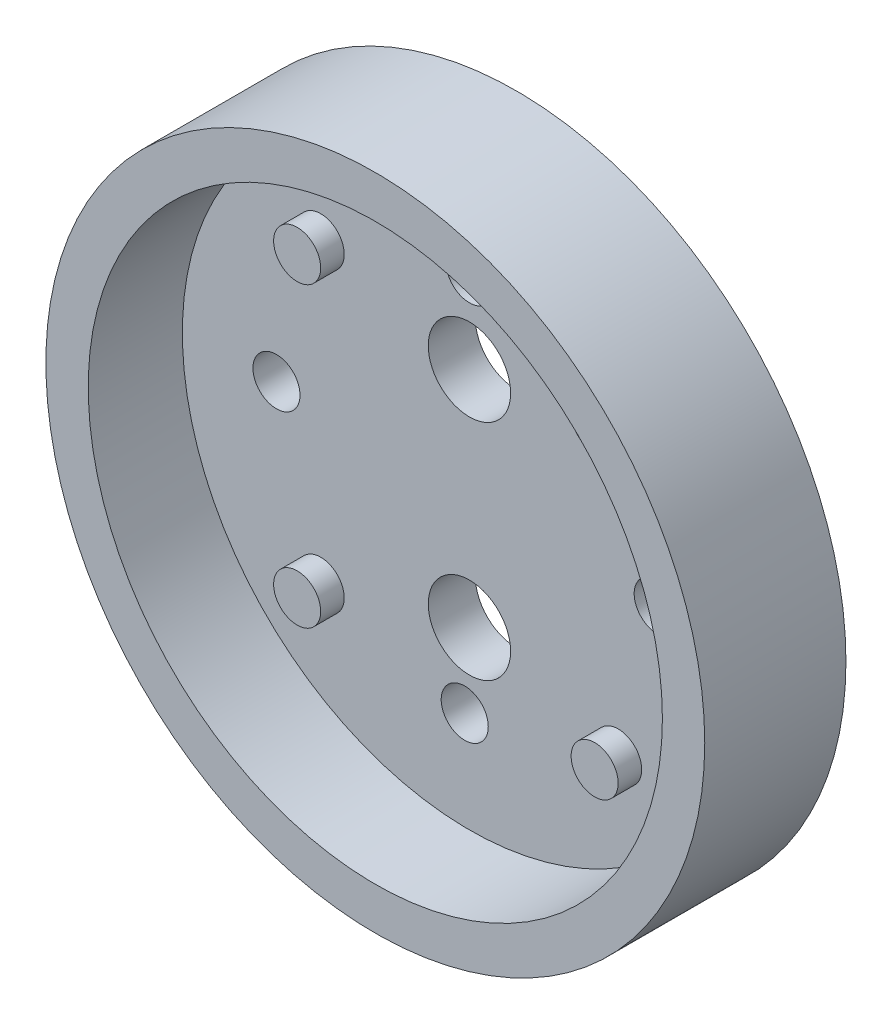
ISO-10303-21;
HEADER;
FILE_DESCRIPTION(('STEP AP214'),'2;1');
FILE_NAME('part.step','',(''),(''),'','','');
FILE_SCHEMA(('AUTOMOTIVE_DESIGN { 1 0 10303 214 1 1 1 1 }'));
ENDSEC;
DATA;
#1=APPLICATION_CONTEXT('core data for automotive mechanical design processes');
#2=APPLICATION_PROTOCOL_DEFINITION('international standard','automotive_design',2000,#1);
#3=PRODUCT_CONTEXT('',#1,'mechanical');
#4=PRODUCT('Part','Part','',(#3));
#5=PRODUCT_RELATED_PRODUCT_CATEGORY('part','',(#4));
#6=PRODUCT_DEFINITION_FORMATION('','',#4);
#7=PRODUCT_DEFINITION_CONTEXT('part definition',#1,'design');
#8=PRODUCT_DEFINITION('design','',#6,#7);
#9=PRODUCT_DEFINITION_SHAPE('','',#8);
#10=(LENGTH_UNIT() NAMED_UNIT(*) SI_UNIT(.MILLI.,.METRE.));
#11=(NAMED_UNIT(*) PLANE_ANGLE_UNIT() SI_UNIT($,.RADIAN.));
#12=(NAMED_UNIT(*) SI_UNIT($,.STERADIAN.) SOLID_ANGLE_UNIT());
#13=UNCERTAINTY_MEASURE_WITH_UNIT(LENGTH_MEASURE(1.E-05),#10,'distance_accuracy_value','');
#14=(GEOMETRIC_REPRESENTATION_CONTEXT(3) GLOBAL_UNCERTAINTY_ASSIGNED_CONTEXT((#13)) GLOBAL_UNIT_ASSIGNED_CONTEXT((#10,
#11,#12)) REPRESENTATION_CONTEXT('',''));
#15=CARTESIAN_POINT('',(0.,0.,0.));
#16=DIRECTION('',(0.,0.,1.));
#17=DIRECTION('',(1.,0.,0.));
#18=AXIS2_PLACEMENT_3D('',#15,#16,#17);
#19=CARTESIAN_POINT('',(0.,0.,2.));
#20=DIRECTION('',(0.,0.,1.));
#21=DIRECTION('',(1.,0.,0.));
#22=AXIS2_PLACEMENT_3D('',#19,#20,#21);
#23=PLANE('',#22);
#24=CARTESIAN_POINT('',(6.32077084341238,6.32077084341231,2.));
#25=DIRECTION('',(0.,0.,1.));
#26=DIRECTION('',(1.,0.,0.));
#27=AXIS2_PLACEMENT_3D('',#24,#25,#26);
#28=CIRCLE('',#27,0.999999999999999);
#29=CARTESIAN_POINT('',(7.32077084341238,6.32077084341231,2.));
#30=VERTEX_POINT('',#29);
#31=EDGE_CURVE('E102',#30,#30,#28,.T.);
#32=ORIENTED_EDGE('',*,*,#31,.F.);
#33=EDGE_LOOP('',(#32));
#34=FACE_BOUND('',#33,.T.);
#35=CARTESIAN_POINT('',(-6.32077084341233,-6.32077084341236,2.));
#36=DIRECTION('',(0.,0.,1.));
#37=DIRECTION('',(1.,0.,0.));
#38=AXIS2_PLACEMENT_3D('',#35,#36,#37);
#39=CIRCLE('',#38,1.);
#40=CARTESIAN_POINT('',(-5.32077084341233,-6.32077084341236,2.));
#41=VERTEX_POINT('',#40);
#42=EDGE_CURVE('E90',#41,#41,#39,.T.);
#43=ORIENTED_EDGE('',*,*,#42,.F.);
#44=EDGE_LOOP('',(#43));
#45=FACE_BOUND('',#44,.T.);
#46=CARTESIAN_POINT('',(0.,-4.75,2.));
#47=DIRECTION('',(0.,0.,1.));
#48=DIRECTION('',(1.,0.,0.));
#49=AXIS2_PLACEMENT_3D('',#46,#47,#48);
#50=CIRCLE('',#49,1.75);
#51=CARTESIAN_POINT('',(1.75,-4.75,2.));
#52=VERTEX_POINT('',#51);
#53=EDGE_CURVE('E84',#52,#52,#50,.T.);
#54=ORIENTED_EDGE('',*,*,#53,.F.);
#55=EDGE_LOOP('',(#54));
#56=FACE_BOUND('',#55,.T.);
#57=CARTESIAN_POINT('',(0.,4.75,2.));
#58=DIRECTION('',(0.,0.,1.));
#59=DIRECTION('',(1.,0.,0.));
#60=AXIS2_PLACEMENT_3D('',#57,#58,#59);
#61=CIRCLE('',#60,1.75);
#62=CARTESIAN_POINT('',(1.75,4.75,2.));
#63=VERTEX_POINT('',#62);
#64=EDGE_CURVE('E78',#63,#63,#61,.T.);
#65=ORIENTED_EDGE('',*,*,#64,.F.);
#66=EDGE_LOOP('',(#65));
#67=FACE_BOUND('',#66,.T.);
#68=CARTESIAN_POINT('',(-8.2,0.2,2.));
#69=DIRECTION('',(0.,0.,1.));
#70=DIRECTION('',(1.,0.,0.));
#71=AXIS2_PLACEMENT_3D('',#68,#69,#70);
#72=CIRCLE('',#71,1.);
#73=CARTESIAN_POINT('',(-7.2,0.2,2.));
#74=VERTEX_POINT('',#73);
#75=EDGE_CURVE('E72',#74,#74,#72,.T.);
#76=ORIENTED_EDGE('',*,*,#75,.F.);
#77=EDGE_LOOP('',(#76));
#78=FACE_BOUND('',#77,.T.);
#79=CARTESIAN_POINT('',(-0.200000000000001,-8.,2.));
#80=DIRECTION('',(0.,0.,1.));
#81=DIRECTION('',(1.,0.,0.));
#82=AXIS2_PLACEMENT_3D('',#79,#80,#81);
#83=CIRCLE('',#82,1.);
#84=CARTESIAN_POINT('',(0.799999999999999,-8.,2.));
#85=VERTEX_POINT('',#84);
#86=EDGE_CURVE('E66',#85,#85,#83,.T.);
#87=ORIENTED_EDGE('',*,*,#86,.F.);
#88=EDGE_LOOP('',(#87));
#89=FACE_BOUND('',#88,.T.);
#90=CARTESIAN_POINT('',(8.,0.,2.));
#91=DIRECTION('',(0.,0.,1.));
#92=DIRECTION('',(1.,0.,0.));
#93=AXIS2_PLACEMENT_3D('',#90,#91,#92);
#94=CIRCLE('',#93,1.);
#95=CARTESIAN_POINT('',(9.,0.,2.));
#96=VERTEX_POINT('',#95);
#97=EDGE_CURVE('E60',#96,#96,#94,.T.);
#98=ORIENTED_EDGE('',*,*,#97,.F.);
#99=EDGE_LOOP('',(#98));
#100=FACE_BOUND('',#99,.T.);
#101=CARTESIAN_POINT('',(0.,8.2,2.));
#102=DIRECTION('',(0.,0.,1.));
#103=DIRECTION('',(1.,0.,0.));
#104=AXIS2_PLACEMENT_3D('',#101,#102,#103);
#105=CIRCLE('',#104,1.);
#106=CARTESIAN_POINT('',(1.,8.2,2.));
#107=VERTEX_POINT('',#106);
#108=EDGE_CURVE('E54',#107,#107,#105,.T.);
#109=ORIENTED_EDGE('',*,*,#108,.F.);
#110=EDGE_LOOP('',(#109));
#111=FACE_BOUND('',#110,.T.);
#112=CARTESIAN_POINT('',(0.,0.,2.));
#113=DIRECTION('',(0.,0.,1.));
#114=DIRECTION('',(1.,0.,0.));
#115=AXIS2_PLACEMENT_3D('',#112,#113,#114);
#116=CIRCLE('',#115,12.2);
#117=CARTESIAN_POINT('',(12.2,0.,2.));
#118=VERTEX_POINT('',#117);
#119=EDGE_CURVE('E10',#118,#118,#116,.F.);
#120=ORIENTED_EDGE('',*,*,#119,.F.);
#121=EDGE_LOOP('',(#120));
#122=FACE_BOUND('',#121,.T.);
#123=CARTESIAN_POINT('',(-6.32077084341234,6.32077084341236,2.));
#124=DIRECTION('',(0.,0.,1.));
#125=DIRECTION('',(1.,0.,0.));
#126=AXIS2_PLACEMENT_3D('',#123,#124,#125);
#127=CIRCLE('',#126,1.);
#128=CARTESIAN_POINT('',(-5.32077084341234,6.32077084341236,2.));
#129=VERTEX_POINT('',#128);
#130=EDGE_CURVE('E96',#129,#129,#127,.T.);
#131=ORIENTED_EDGE('',*,*,#130,.F.);
#132=EDGE_LOOP('',(#131));
#133=FACE_BOUND('',#132,.T.);
#134=CARTESIAN_POINT('',(6.3207708434123,-6.3207708434124,2.));
#135=DIRECTION('',(0.,0.,1.));
#136=DIRECTION('',(1.,0.,0.));
#137=AXIS2_PLACEMENT_3D('',#134,#135,#136);
#138=CIRCLE('',#137,0.999999999999999);
#139=CARTESIAN_POINT('',(7.32077084341229,-6.3207708434124,2.));
#140=VERTEX_POINT('',#139);
#141=EDGE_CURVE('E108',#140,#140,#138,.T.);
#142=ORIENTED_EDGE('',*,*,#141,.F.);
#143=EDGE_LOOP('',(#142));
#144=FACE_BOUND('',#143,.T.);
#145=ADVANCED_FACE('F33',(#34,#45,#56,#67,#78,#89,#100,#111,#122,#133,#144),#23,.T.);
#146=CARTESIAN_POINT('',(0.,0.,2.));
#147=DIRECTION('',(0.,0.,-1.));
#148=DIRECTION('',(-1.,0.,0.));
#149=AXIS2_PLACEMENT_3D('',#146,#147,#148);
#150=CYLINDRICAL_SURFACE('',#149,14.);
#151=CARTESIAN_POINT('',(0.,0.,0.));
#152=DIRECTION('',(0.,0.,1.));
#153=DIRECTION('',(1.,0.,0.));
#154=AXIS2_PLACEMENT_3D('',#151,#152,#153);
#155=CIRCLE('',#154,14.);
#156=CARTESIAN_POINT('',(14.,0.,0.));
#157=VERTEX_POINT('',#156);
#158=EDGE_CURVE('E40',#157,#157,#155,.T.);
#159=ORIENTED_EDGE('',*,*,#158,.T.);
#160=EDGE_LOOP('',(#159));
#161=FACE_BOUND('',#160,.T.);
#162=CARTESIAN_POINT('',(0.,0.,6.));
#163=DIRECTION('',(0.,0.,1.));
#164=DIRECTION('',(1.,0.,0.));
#165=AXIS2_PLACEMENT_3D('',#162,#163,#164);
#166=CIRCLE('',#165,14.);
#167=CARTESIAN_POINT('',(14.,0.,6.));
#168=VERTEX_POINT('',#167);
#169=EDGE_CURVE('E44',#168,#168,#166,.T.);
#170=ORIENTED_EDGE('',*,*,#169,.F.);
#171=EDGE_LOOP('',(#170));
#172=FACE_BOUND('',#171,.T.);
#173=ADVANCED_FACE('F35',(#161,#172),#150,.T.);
#174=CARTESIAN_POINT('',(0.,0.,0.));
#175=DIRECTION('',(0.,0.,1.));
#176=DIRECTION('',(1.,0.,0.));
#177=AXIS2_PLACEMENT_3D('',#174,#175,#176);
#178=PLANE('',#177);
#179=CARTESIAN_POINT('',(0.,-4.75,0.));
#180=DIRECTION('',(0.,0.,1.));
#181=DIRECTION('',(1.,0.,0.));
#182=AXIS2_PLACEMENT_3D('',#179,#180,#181);
#183=CIRCLE('',#182,1.75);
#184=CARTESIAN_POINT('',(1.75,-4.75,0.));
#185=VERTEX_POINT('',#184);
#186=EDGE_CURVE('E81',#185,#185,#183,.T.);
#187=ORIENTED_EDGE('',*,*,#186,.T.);
#188=EDGE_LOOP('',(#187));
#189=FACE_BOUND('',#188,.T.);
#190=CARTESIAN_POINT('',(0.,4.75,0.));
#191=DIRECTION('',(0.,0.,1.));
#192=DIRECTION('',(1.,0.,0.));
#193=AXIS2_PLACEMENT_3D('',#190,#191,#192);
#194=CIRCLE('',#193,1.75);
#195=CARTESIAN_POINT('',(1.75,4.75,0.));
#196=VERTEX_POINT('',#195);
#197=EDGE_CURVE('E75',#196,#196,#194,.T.);
#198=ORIENTED_EDGE('',*,*,#197,.T.);
#199=EDGE_LOOP('',(#198));
#200=FACE_BOUND('',#199,.T.);
#201=CARTESIAN_POINT('',(-8.2,0.2,0.));
#202=DIRECTION('',(0.,0.,1.));
#203=DIRECTION('',(1.,0.,0.));
#204=AXIS2_PLACEMENT_3D('',#201,#202,#203);
#205=CIRCLE('',#204,1.);
#206=CARTESIAN_POINT('',(-7.2,0.2,0.));
#207=VERTEX_POINT('',#206);
#208=EDGE_CURVE('E69',#207,#207,#205,.T.);
#209=ORIENTED_EDGE('',*,*,#208,.T.);
#210=EDGE_LOOP('',(#209));
#211=FACE_BOUND('',#210,.T.);
#212=CARTESIAN_POINT('',(-0.200000000000001,-8.,0.));
#213=DIRECTION('',(0.,0.,1.));
#214=DIRECTION('',(1.,0.,0.));
#215=AXIS2_PLACEMENT_3D('',#212,#213,#214);
#216=CIRCLE('',#215,1.);
#217=CARTESIAN_POINT('',(0.799999999999999,-8.,0.));
#218=VERTEX_POINT('',#217);
#219=EDGE_CURVE('E63',#218,#218,#216,.T.);
#220=ORIENTED_EDGE('',*,*,#219,.T.);
#221=EDGE_LOOP('',(#220));
#222=FACE_BOUND('',#221,.T.);
#223=CARTESIAN_POINT('',(8.,0.,0.));
#224=DIRECTION('',(0.,0.,1.));
#225=DIRECTION('',(1.,0.,0.));
#226=AXIS2_PLACEMENT_3D('',#223,#224,#225);
#227=CIRCLE('',#226,1.);
#228=CARTESIAN_POINT('',(9.,0.,0.));
#229=VERTEX_POINT('',#228);
#230=EDGE_CURVE('E57',#229,#229,#227,.T.);
#231=ORIENTED_EDGE('',*,*,#230,.T.);
#232=EDGE_LOOP('',(#231));
#233=FACE_BOUND('',#232,.T.);
#234=CARTESIAN_POINT('',(0.,8.2,0.));
#235=DIRECTION('',(0.,0.,1.));
#236=DIRECTION('',(1.,0.,0.));
#237=AXIS2_PLACEMENT_3D('',#234,#235,#236);
#238=CIRCLE('',#237,1.);
#239=CARTESIAN_POINT('',(1.,8.2,0.));
#240=VERTEX_POINT('',#239);
#241=EDGE_CURVE('E53',#240,#240,#238,.T.);
#242=ORIENTED_EDGE('',*,*,#241,.T.);
#243=EDGE_LOOP('',(#242));
#244=FACE_BOUND('',#243,.T.);
#245=ORIENTED_EDGE('',*,*,#158,.F.);
#246=EDGE_LOOP('',(#245));
#247=FACE_BOUND('',#246,.T.);
#248=ADVANCED_FACE('F129',(#189,#200,#211,#222,#233,#244,#247),#178,.F.);
#249=CARTESIAN_POINT('',(0.,0.,6.));
#250=DIRECTION('',(0.,0.,1.));
#251=DIRECTION('',(1.,0.,0.));
#252=AXIS2_PLACEMENT_3D('',#249,#250,#251);
#253=PLANE('',#252);
#254=ORIENTED_EDGE('',*,*,#169,.T.);
#255=EDGE_LOOP('',(#254));
#256=FACE_BOUND('',#255,.T.);
#257=CARTESIAN_POINT('',(0.,0.,6.));
#258=DIRECTION('',(0.,0.,1.));
#259=DIRECTION('',(1.,0.,0.));
#260=AXIS2_PLACEMENT_3D('',#257,#258,#259);
#261=CIRCLE('',#260,12.2);
#262=CARTESIAN_POINT('',(12.2,0.,6.));
#263=VERTEX_POINT('',#262);
#264=EDGE_CURVE('E48',#263,#263,#261,.T.);
#265=ORIENTED_EDGE('',*,*,#264,.F.);
#266=EDGE_LOOP('',(#265));
#267=FACE_BOUND('',#266,.T.);
#268=ADVANCED_FACE('F133',(#256,#267),#253,.T.);
#269=CARTESIAN_POINT('',(0.,0.,6.));
#270=DIRECTION('',(0.,0.,-1.));
#271=DIRECTION('',(-1.,0.,0.));
#272=AXIS2_PLACEMENT_3D('',#269,#270,#271);
#273=CYLINDRICAL_SURFACE('',#272,12.2);
#274=ORIENTED_EDGE('',*,*,#264,.T.);
#275=EDGE_LOOP('',(#274));
#276=FACE_BOUND('',#275,.T.);
#277=ORIENTED_EDGE('',*,*,#119,.T.);
#278=EDGE_LOOP('',(#277));
#279=FACE_BOUND('',#278,.T.);
#280=ADVANCED_FACE('F140',(#276,#279),#273,.F.);
#281=CARTESIAN_POINT('',(0.,8.2,0.));
#282=DIRECTION('',(0.,0.,1.));
#283=DIRECTION('',(1.,0.,0.));
#284=AXIS2_PLACEMENT_3D('',#281,#282,#283);
#285=CYLINDRICAL_SURFACE('',#284,1.);
#286=ORIENTED_EDGE('',*,*,#241,.F.);
#287=EDGE_LOOP('',(#286));
#288=FACE_BOUND('',#287,.T.);
#289=ORIENTED_EDGE('',*,*,#108,.T.);
#290=EDGE_LOOP('',(#289));
#291=FACE_BOUND('',#290,.T.);
#292=ADVANCED_FACE('F155',(#288,#291),#285,.F.);
#293=CARTESIAN_POINT('',(8.,0.,0.));
#294=DIRECTION('',(0.,0.,1.));
#295=DIRECTION('',(1.,0.,0.));
#296=AXIS2_PLACEMENT_3D('',#293,#294,#295);
#297=CYLINDRICAL_SURFACE('',#296,1.);
#298=ORIENTED_EDGE('',*,*,#230,.F.);
#299=EDGE_LOOP('',(#298));
#300=FACE_BOUND('',#299,.T.);
#301=ORIENTED_EDGE('',*,*,#97,.T.);
#302=EDGE_LOOP('',(#301));
#303=FACE_BOUND('',#302,.T.);
#304=ADVANCED_FACE('F158',(#300,#303),#297,.F.);
#305=CARTESIAN_POINT('',(-0.200000000000001,-8.,0.));
#306=DIRECTION('',(0.,0.,1.));
#307=DIRECTION('',(1.,0.,0.));
#308=AXIS2_PLACEMENT_3D('',#305,#306,#307);
#309=CYLINDRICAL_SURFACE('',#308,1.);
#310=ORIENTED_EDGE('',*,*,#219,.F.);
#311=EDGE_LOOP('',(#310));
#312=FACE_BOUND('',#311,.T.);
#313=ORIENTED_EDGE('',*,*,#86,.T.);
#314=EDGE_LOOP('',(#313));
#315=FACE_BOUND('',#314,.T.);
#316=ADVANCED_FACE('F199',(#312,#315),#309,.F.);
#317=CARTESIAN_POINT('',(-8.2,0.2,0.));
#318=DIRECTION('',(0.,0.,1.));
#319=DIRECTION('',(1.,0.,0.));
#320=AXIS2_PLACEMENT_3D('',#317,#318,#319);
#321=CYLINDRICAL_SURFACE('',#320,1.);
#322=ORIENTED_EDGE('',*,*,#208,.F.);
#323=EDGE_LOOP('',(#322));
#324=FACE_BOUND('',#323,.T.);
#325=ORIENTED_EDGE('',*,*,#75,.T.);
#326=EDGE_LOOP('',(#325));
#327=FACE_BOUND('',#326,.T.);
#328=ADVANCED_FACE('F195',(#324,#327),#321,.F.);
#329=CARTESIAN_POINT('',(0.,4.75,0.));
#330=DIRECTION('',(0.,0.,1.));
#331=DIRECTION('',(1.,0.,0.));
#332=AXIS2_PLACEMENT_3D('',#329,#330,#331);
#333=CYLINDRICAL_SURFACE('',#332,1.75);
#334=ORIENTED_EDGE('',*,*,#197,.F.);
#335=EDGE_LOOP('',(#334));
#336=FACE_BOUND('',#335,.T.);
#337=ORIENTED_EDGE('',*,*,#64,.T.);
#338=EDGE_LOOP('',(#337));
#339=FACE_BOUND('',#338,.T.);
#340=ADVANCED_FACE('F191',(#336,#339),#333,.F.);
#341=CARTESIAN_POINT('',(0.,-4.75,0.));
#342=DIRECTION('',(0.,0.,1.));
#343=DIRECTION('',(1.,0.,0.));
#344=AXIS2_PLACEMENT_3D('',#341,#342,#343);
#345=CYLINDRICAL_SURFACE('',#344,1.75);
#346=ORIENTED_EDGE('',*,*,#186,.F.);
#347=EDGE_LOOP('',(#346));
#348=FACE_BOUND('',#347,.T.);
#349=ORIENTED_EDGE('',*,*,#53,.T.);
#350=EDGE_LOOP('',(#349));
#351=FACE_BOUND('',#350,.T.);
#352=ADVANCED_FACE('F187',(#348,#351),#345,.F.);
#353=CARTESIAN_POINT('',(-6.32077084341233,-6.32077084341236,3.));
#354=DIRECTION('',(0.,0.,-1.));
#355=DIRECTION('',(-1.,0.,0.));
#356=AXIS2_PLACEMENT_3D('',#353,#354,#355);
#357=CYLINDRICAL_SURFACE('',#356,1.);
#358=CARTESIAN_POINT('',(-6.32077084341233,-6.32077084341236,3.));
#359=DIRECTION('',(0.,0.,1.));
#360=DIRECTION('',(1.,0.,0.));
#361=AXIS2_PLACEMENT_3D('',#358,#359,#360);
#362=CIRCLE('',#361,1.);
#363=CARTESIAN_POINT('',(-5.32077084341233,-6.32077084341236,3.));
#364=VERTEX_POINT('',#363);
#365=EDGE_CURVE('E87',#364,#364,#362,.T.);
#366=ORIENTED_EDGE('',*,*,#365,.F.);
#367=EDGE_LOOP('',(#366));
#368=FACE_BOUND('',#367,.T.);
#369=ORIENTED_EDGE('',*,*,#42,.T.);
#370=EDGE_LOOP('',(#369));
#371=FACE_BOUND('',#370,.T.);
#372=ADVANCED_FACE('F179',(#368,#371),#357,.T.);
#373=CARTESIAN_POINT('',(-6.32077084341233,-6.32077084341236,3.));
#374=DIRECTION('',(0.,0.,1.));
#375=DIRECTION('',(1.,0.,0.));
#376=AXIS2_PLACEMENT_3D('',#373,#374,#375);
#377=PLANE('',#376);
#378=ORIENTED_EDGE('',*,*,#365,.T.);
#379=EDGE_LOOP('',(#378));
#380=FACE_BOUND('',#379,.T.);
#381=ADVANCED_FACE('F169',(#380),#377,.T.);
#382=CARTESIAN_POINT('',(-6.32077084341234,6.32077084341236,3.));
#383=DIRECTION('',(0.,0.,-1.));
#384=DIRECTION('',(-1.,0.,0.));
#385=AXIS2_PLACEMENT_3D('',#382,#383,#384);
#386=CYLINDRICAL_SURFACE('',#385,1.);
#387=CARTESIAN_POINT('',(-6.32077084341234,6.32077084341236,3.));
#388=DIRECTION('',(0.,0.,1.));
#389=DIRECTION('',(1.,0.,0.));
#390=AXIS2_PLACEMENT_3D('',#387,#388,#389);
#391=CIRCLE('',#390,1.);
#392=CARTESIAN_POINT('',(-5.32077084341234,6.32077084341236,3.));
#393=VERTEX_POINT('',#392);
#394=EDGE_CURVE('E93',#393,#393,#391,.T.);
#395=ORIENTED_EDGE('',*,*,#394,.F.);
#396=EDGE_LOOP('',(#395));
#397=FACE_BOUND('',#396,.T.);
#398=ORIENTED_EDGE('',*,*,#130,.T.);
#399=EDGE_LOOP('',(#398));
#400=FACE_BOUND('',#399,.T.);
#401=ADVANCED_FACE('F166',(#397,#400),#386,.T.);
#402=CARTESIAN_POINT('',(-6.32077084341234,6.32077084341236,3.));
#403=DIRECTION('',(0.,0.,1.));
#404=DIRECTION('',(1.,0.,0.));
#405=AXIS2_PLACEMENT_3D('',#402,#403,#404);
#406=PLANE('',#405);
#407=ORIENTED_EDGE('',*,*,#394,.T.);
#408=EDGE_LOOP('',(#407));
#409=FACE_BOUND('',#408,.T.);
#410=ADVANCED_FACE('F168',(#409),#406,.T.);
#411=CARTESIAN_POINT('',(6.32077084341238,6.32077084341231,3.));
#412=DIRECTION('',(0.,0.,-1.));
#413=DIRECTION('',(-1.,0.,0.));
#414=AXIS2_PLACEMENT_3D('',#411,#412,#413);
#415=CYLINDRICAL_SURFACE('',#414,0.999999999999999);
#416=CARTESIAN_POINT('',(6.32077084341238,6.32077084341231,3.));
#417=DIRECTION('',(0.,0.,1.));
#418=DIRECTION('',(1.,0.,0.));
#419=AXIS2_PLACEMENT_3D('',#416,#417,#418);
#420=CIRCLE('',#419,0.999999999999999);
#421=CARTESIAN_POINT('',(7.32077084341238,6.32077084341231,3.));
#422=VERTEX_POINT('',#421);
#423=EDGE_CURVE('E99',#422,#422,#420,.T.);
#424=ORIENTED_EDGE('',*,*,#423,.F.);
#425=EDGE_LOOP('',(#424));
#426=FACE_BOUND('',#425,.T.);
#427=ORIENTED_EDGE('',*,*,#31,.T.);
#428=EDGE_LOOP('',(#427));
#429=FACE_BOUND('',#428,.T.);
#430=ADVANCED_FACE('F176',(#426,#429),#415,.T.);
#431=CARTESIAN_POINT('',(6.32077084341238,6.32077084341231,3.));
#432=DIRECTION('',(0.,0.,1.));
#433=DIRECTION('',(1.,0.,0.));
#434=AXIS2_PLACEMENT_3D('',#431,#432,#433);
#435=PLANE('',#434);
#436=ORIENTED_EDGE('',*,*,#423,.T.);
#437=EDGE_LOOP('',(#436));
#438=FACE_BOUND('',#437,.T.);
#439=ADVANCED_FACE('F119',(#438),#435,.T.);
#440=CARTESIAN_POINT('',(6.3207708434123,-6.3207708434124,3.));
#441=DIRECTION('',(0.,0.,-1.));
#442=DIRECTION('',(-1.,0.,0.));
#443=AXIS2_PLACEMENT_3D('',#440,#441,#442);
#444=CYLINDRICAL_SURFACE('',#443,0.999999999999999);
#445=CARTESIAN_POINT('',(6.3207708434123,-6.3207708434124,3.));
#446=DIRECTION('',(0.,0.,1.));
#447=DIRECTION('',(1.,0.,0.));
#448=AXIS2_PLACEMENT_3D('',#445,#446,#447);
#449=CIRCLE('',#448,0.999999999999999);
#450=CARTESIAN_POINT('',(7.32077084341229,-6.3207708434124,3.));
#451=VERTEX_POINT('',#450);
#452=EDGE_CURVE('E105',#451,#451,#449,.T.);
#453=ORIENTED_EDGE('',*,*,#452,.F.);
#454=EDGE_LOOP('',(#453));
#455=FACE_BOUND('',#454,.T.);
#456=ORIENTED_EDGE('',*,*,#141,.T.);
#457=EDGE_LOOP('',(#456));
#458=FACE_BOUND('',#457,.T.);
#459=ADVANCED_FACE('F116',(#455,#458),#444,.T.);
#460=CARTESIAN_POINT('',(6.3207708434123,-6.3207708434124,3.));
#461=DIRECTION('',(0.,0.,1.));
#462=DIRECTION('',(1.,0.,0.));
#463=AXIS2_PLACEMENT_3D('',#460,#461,#462);
#464=PLANE('',#463);
#465=ORIENTED_EDGE('',*,*,#452,.T.);
#466=EDGE_LOOP('',(#465));
#467=FACE_BOUND('',#466,.T.);
#468=ADVANCED_FACE('F114',(#467),#464,.T.);
#469=CLOSED_SHELL('',(#145,#173,#248,#268,#280,#292,#304,#316,#328,#340,#352,#372,#381,#401,
#410,#430,#439,#459,#468));
#470=MANIFOLD_SOLID_BREP('B2',#469);
#471=ADVANCED_BREP_SHAPE_REPRESENTATION('',(#18,#470),#14);
#472=SHAPE_DEFINITION_REPRESENTATION(#9,#471);
ENDSEC;
END-ISO-10303-21;
